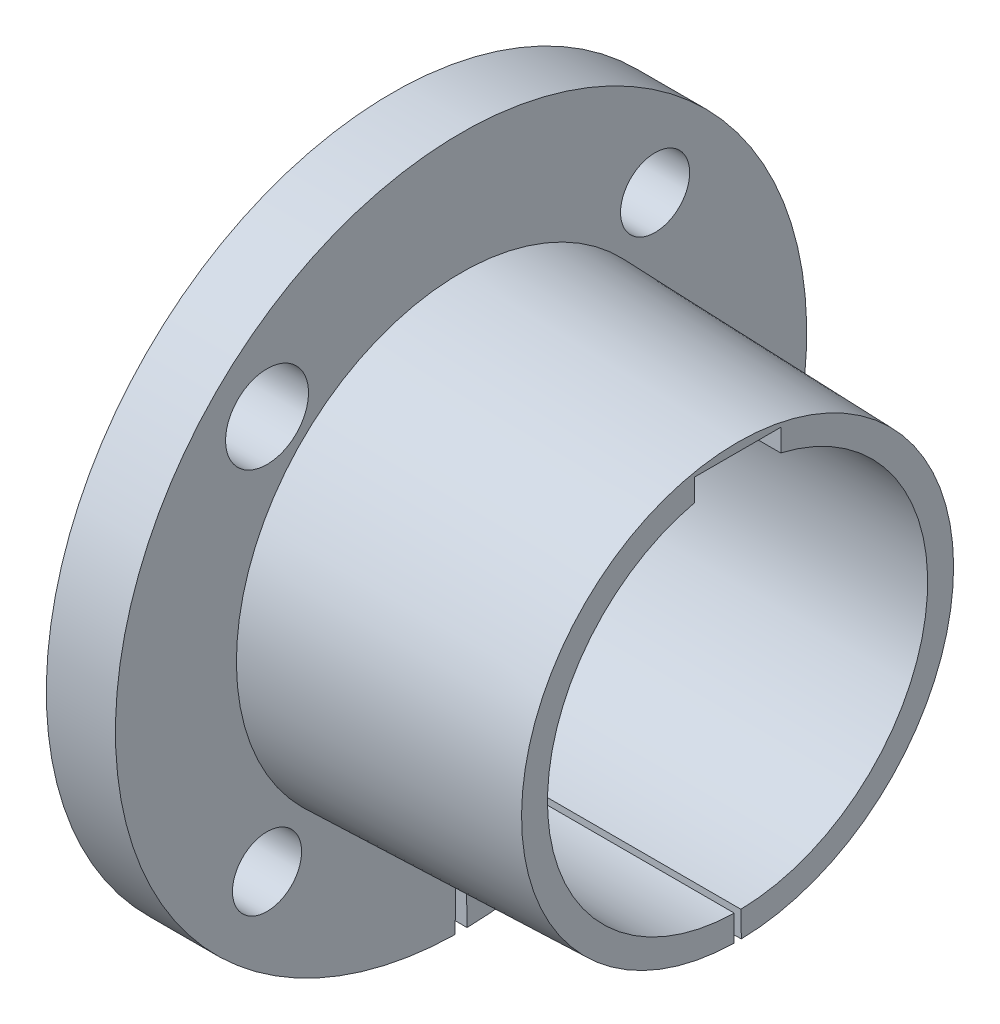
ISO-10303-21;
HEADER;
FILE_DESCRIPTION(('STEP AP214'),'2;1');
FILE_NAME('part.step','',(''),(''),'','','');
FILE_SCHEMA(('AUTOMOTIVE_DESIGN { 1 0 10303 214 1 1 1 1 }'));
ENDSEC;
DATA;
#1=APPLICATION_CONTEXT('core data for automotive mechanical design processes');
#2=APPLICATION_PROTOCOL_DEFINITION('international standard','automotive_design',2000,#1);
#3=PRODUCT_CONTEXT('',#1,'mechanical');
#4=PRODUCT('Part','Part','',(#3));
#5=PRODUCT_RELATED_PRODUCT_CATEGORY('part','',(#4));
#6=PRODUCT_DEFINITION_FORMATION('','',#4);
#7=PRODUCT_DEFINITION_CONTEXT('part definition',#1,'design');
#8=PRODUCT_DEFINITION('design','',#6,#7);
#9=PRODUCT_DEFINITION_SHAPE('','',#8);
#10=(LENGTH_UNIT() NAMED_UNIT(*) SI_UNIT(.MILLI.,.METRE.));
#11=(NAMED_UNIT(*) PLANE_ANGLE_UNIT() SI_UNIT($,.RADIAN.));
#12=(NAMED_UNIT(*) SI_UNIT($,.STERADIAN.) SOLID_ANGLE_UNIT());
#13=UNCERTAINTY_MEASURE_WITH_UNIT(LENGTH_MEASURE(1.E-05),#10,'distance_accuracy_value','');
#14=(GEOMETRIC_REPRESENTATION_CONTEXT(3) GLOBAL_UNCERTAINTY_ASSIGNED_CONTEXT((#13)) GLOBAL_UNIT_ASSIGNED_CONTEXT((#10,
#11,#12)) REPRESENTATION_CONTEXT('',''));
#15=CARTESIAN_POINT('',(0.,0.,0.));
#16=DIRECTION('',(0.,0.,1.));
#17=DIRECTION('',(1.,0.,0.));
#18=AXIS2_PLACEMENT_3D('',#15,#16,#17);
#19=CARTESIAN_POINT('',(-6.35,0.,0.));
#20=DIRECTION('',(1.,0.,0.));
#21=DIRECTION('',(0.,0.,-1.));
#22=AXIS2_PLACEMENT_3D('',#19,#20,#21);
#23=CYLINDRICAL_SURFACE('',#22,17.4624999999998);
#24=DIRECTION('',(-1.,0.,0.));
#25=VECTOR('',#24,1.);
#26=CARTESIAN_POINT('',(25.4,17.0055264454677,-3.96874999999998));
#27=LINE('',#26,#25);
#28=CARTESIAN_POINT('',(25.4,17.0055264454677,-3.96874999999998));
#29=VERTEX_POINT('',#28);
#30=CARTESIAN_POINT('',(-6.35,17.0055264454677,-3.96874999999998));
#31=VERTEX_POINT('',#30);
#32=EDGE_CURVE('E151',#29,#31,#27,.T.);
#33=ORIENTED_EDGE('',*,*,#32,.T.);
#34=CARTESIAN_POINT('',(-6.35,0.,0.));
#35=DIRECTION('',(1.,0.,0.));
#36=DIRECTION('',(0.,0.,-1.));
#37=AXIS2_PLACEMENT_3D('',#34,#35,#36);
#38=CIRCLE('',#37,17.4624999999998);
#39=CARTESIAN_POINT('',(-6.35,-17.4598403766682,-0.304762647411291));
#40=VERTEX_POINT('',#39);
#41=EDGE_CURVE('E43',#40,#31,#38,.T.);
#42=ORIENTED_EDGE('',*,*,#41,.F.);
#43=DIRECTION('',(1.,0.,0.));
#44=VECTOR('',#43,1.);
#45=CARTESIAN_POINT('',(-6.35,-17.4598403766682,-0.304762647411291));
#46=LINE('',#45,#44);
#47=CARTESIAN_POINT('',(25.4,-17.4598403766682,-0.304762647411291));
#48=VERTEX_POINT('',#47);
#49=EDGE_CURVE('E98',#40,#48,#46,.T.);
#50=ORIENTED_EDGE('',*,*,#49,.T.);
#51=CARTESIAN_POINT('',(25.4,0.,0.));
#52=DIRECTION('',(1.,0.,0.));
#53=DIRECTION('',(0.,0.,-1.));
#54=AXIS2_PLACEMENT_3D('',#51,#52,#53);
#55=CIRCLE('',#54,17.4624999999998);
#56=EDGE_CURVE('E95',#48,#29,#55,.T.);
#57=ORIENTED_EDGE('',*,*,#56,.T.);
#58=EDGE_LOOP('',(#33,#42,#50,#57));
#59=FACE_BOUND('',#58,.T.);
#60=ADVANCED_FACE('F33',(#59),#23,.F.);
#61=CARTESIAN_POINT('',(-6.35,0.,0.));
#62=DIRECTION('',(1.,0.,0.));
#63=DIRECTION('',(0.,0.,-1.));
#64=AXIS2_PLACEMENT_3D('',#61,#62,#63);
#65=CYLINDRICAL_SURFACE('',#64,31.7499999999938);
#66=CARTESIAN_POINT('',(0.,0.,0.));
#67=DIRECTION('',(1.,0.,0.));
#68=DIRECTION('',(0.,0.,-1.));
#69=AXIS2_PLACEMENT_3D('',#66,#67,#68);
#70=CIRCLE('',#69,31.75);
#71=CARTESIAN_POINT('',(0.,-31.7451643212154,-0.554113904383627));
#72=VERTEX_POINT('',#71);
#73=CARTESIAN_POINT('',(0.,-31.7451643212092,0.554113904383527));
#74=VERTEX_POINT('',#73);
#75=EDGE_CURVE('E52',#72,#74,#70,.T.);
#76=ORIENTED_EDGE('',*,*,#75,.F.);
#77=DIRECTION('',(-1.,0.,0.));
#78=VECTOR('',#77,1.);
#79=CARTESIAN_POINT('',(25.4,-31.7451643212092,-0.554113904384065));
#80=LINE('',#79,#78);
#81=CARTESIAN_POINT('',(-6.35,-31.7451643212092,-0.554113904384065));
#82=VERTEX_POINT('',#81);
#83=EDGE_CURVE('E173',#72,#82,#80,.T.);
#84=ORIENTED_EDGE('',*,*,#83,.T.);
#85=CARTESIAN_POINT('',(-6.35,0.,0.));
#86=DIRECTION('',(1.,0.,0.));
#87=DIRECTION('',(0.,0.,-1.));
#88=AXIS2_PLACEMENT_3D('',#85,#86,#87);
#89=CIRCLE('',#88,31.7499999999938);
#90=CARTESIAN_POINT('',(-6.35,-31.7451643212092,0.554113904383527));
#91=VERTEX_POINT('',#90);
#92=EDGE_CURVE('E11',#82,#91,#89,.T.);
#93=ORIENTED_EDGE('',*,*,#92,.T.);
#94=DIRECTION('',(-1.,0.,0.));
#95=VECTOR('',#94,1.);
#96=CARTESIAN_POINT('',(25.4,-31.7451643212092,0.554113904383527));
#97=LINE('',#96,#95);
#98=EDGE_CURVE('E154',#74,#91,#97,.T.);
#99=ORIENTED_EDGE('',*,*,#98,.F.);
#100=EDGE_LOOP('',(#76,#84,#93,#99));
#101=FACE_BOUND('',#100,.T.);
#102=ADVANCED_FACE('F218',(#101),#65,.T.);
#103=CARTESIAN_POINT('',(-6.35,-31.7451643212092,-0.554113904384065));
#104=DIRECTION('',(-1.,0.,0.));
#105=DIRECTION('',(0.,0.,1.));
#106=AXIS2_PLACEMENT_3D('',#103,#104,#105);
#107=PLANE('',#106);
#108=CARTESIAN_POINT('',(-6.35,18.0967490910192,-17.8232340594144));
#109=DIRECTION('',(-1.,0.,0.));
#110=DIRECTION('',(0.,0.,1.));
#111=AXIS2_PLACEMENT_3D('',#108,#109,#110);
#112=CIRCLE('',#111,3.17500000000001);
#113=CARTESIAN_POINT('',(-6.35,18.0967490910192,-14.6482340594143));
#114=VERTEX_POINT('',#113);
#115=EDGE_CURVE('E264',#114,#114,#112,.T.);
#116=ORIENTED_EDGE('',*,*,#115,.F.);
#117=EDGE_LOOP('',(#116));
#118=FACE_BOUND('',#117,.T.);
#119=CARTESIAN_POINT('',(-6.35,-18.0967490910192,17.8232340594144));
#120=DIRECTION('',(-1.,0.,0.));
#121=DIRECTION('',(0.,0.,1.));
#122=AXIS2_PLACEMENT_3D('',#119,#120,#121);
#123=CIRCLE('',#122,3.17500000000001);
#124=CARTESIAN_POINT('',(-6.35,-18.0967490910192,20.9982340594144));
#125=VERTEX_POINT('',#124);
#126=EDGE_CURVE('E126',#125,#125,#123,.T.);
#127=ORIENTED_EDGE('',*,*,#126,.F.);
#128=EDGE_LOOP('',(#127));
#129=FACE_BOUND('',#128,.T.);
#130=CARTESIAN_POINT('',(-6.35,-18.0967490910192,-17.8232340594144));
#131=DIRECTION('',(-1.,0.,0.));
#132=DIRECTION('',(0.,0.,1.));
#133=AXIS2_PLACEMENT_3D('',#130,#131,#132);
#134=CIRCLE('',#133,3.80999999999999);
#135=CARTESIAN_POINT('',(-6.35,-18.0967490910192,-14.0132340594144));
#136=VERTEX_POINT('',#135);
#137=EDGE_CURVE('E115',#136,#136,#134,.T.);
#138=ORIENTED_EDGE('',*,*,#137,.F.);
#139=EDGE_LOOP('',(#138));
#140=FACE_BOUND('',#139,.T.);
#141=CARTESIAN_POINT('',(-6.35,18.0967490910192,17.8232340594144));
#142=DIRECTION('',(-1.,0.,0.));
#143=DIRECTION('',(0.,0.,1.));
#144=AXIS2_PLACEMENT_3D('',#141,#142,#143);
#145=CIRCLE('',#144,3.80999999999999);
#146=CARTESIAN_POINT('',(-6.35,18.0967490910192,21.6332340594143));
#147=VERTEX_POINT('',#146);
#148=EDGE_CURVE('E112',#147,#147,#145,.T.);
#149=ORIENTED_EDGE('',*,*,#148,.F.);
#150=EDGE_LOOP('',(#149));
#151=FACE_BOUND('',#150,.T.);
#152=DIRECTION('',(0.,-1.,0.));
#153=VECTOR('',#152,1.);
#154=CARTESIAN_POINT('',(-6.35,19.05,-3.96875));
#155=LINE('',#154,#153);
#156=CARTESIAN_POINT('',(-6.35,19.05,-3.96875));
#157=VERTEX_POINT('',#156);
#158=EDGE_CURVE('E138',#157,#31,#155,.T.);
#159=ORIENTED_EDGE('',*,*,#158,.F.);
#160=DIRECTION('',(0.,0.,-1.));
#161=VECTOR('',#160,1.);
#162=CARTESIAN_POINT('',(-6.35,19.05,3.96875));
#163=LINE('',#162,#161);
#164=CARTESIAN_POINT('',(-6.35,19.05,3.96875));
#165=VERTEX_POINT('',#164);
#166=EDGE_CURVE('E146',#165,#157,#163,.T.);
#167=ORIENTED_EDGE('',*,*,#166,.F.);
#168=DIRECTION('',(0.,1.,0.));
#169=VECTOR('',#168,1.);
#170=CARTESIAN_POINT('',(-6.35,17.0055264454678,3.96875));
#171=LINE('',#170,#169);
#172=CARTESIAN_POINT('',(-6.35,17.0055264454678,3.96875));
#173=VERTEX_POINT('',#172);
#174=EDGE_CURVE('E109',#173,#165,#171,.T.);
#175=ORIENTED_EDGE('',*,*,#174,.F.);
#176=CARTESIAN_POINT('',(-6.35,-17.4598403766682,0.304762647410995));
#177=VERTEX_POINT('',#176);
#178=EDGE_CURVE('E106',#173,#177,#38,.T.);
#179=ORIENTED_EDGE('',*,*,#178,.T.);
#180=DIRECTION('',(0.,0.999847695156391,-0.0174524064372798));
#181=VECTOR('',#180,1.);
#182=CARTESIAN_POINT('',(-6.35,-31.7451643212092,0.554113904383527));
#183=LINE('',#182,#181);
#184=EDGE_CURVE('E165',#91,#177,#183,.T.);
#185=ORIENTED_EDGE('',*,*,#184,.F.);
#186=ORIENTED_EDGE('',*,*,#92,.F.);
#187=DIRECTION('',(0.,0.999847695156391,0.0174524064372968));
#188=VECTOR('',#187,1.);
#189=CARTESIAN_POINT('',(-6.35,-31.7451643212092,-0.554113904384065));
#190=LINE('',#189,#188);
#191=EDGE_CURVE('E102',#82,#40,#190,.T.);
#192=ORIENTED_EDGE('',*,*,#191,.T.);
#193=ORIENTED_EDGE('',*,*,#41,.T.);
#194=EDGE_LOOP('',(#159,#167,#175,#179,#185,#186,#192,#193));
#195=FACE_BOUND('',#194,.T.);
#196=ADVANCED_FACE('F181',(#118,#129,#140,#151,#195),#107,.T.);
#197=DIRECTION('',(-1.,0.,0.));
#198=VECTOR('',#197,1.);
#199=CARTESIAN_POINT('',(25.4,17.0055264454678,3.96875));
#200=LINE('',#199,#198);
#201=CARTESIAN_POINT('',(25.4,17.0055264454678,3.96875));
#202=VERTEX_POINT('',#201);
#203=EDGE_CURVE('E143',#202,#173,#200,.T.);
#204=ORIENTED_EDGE('',*,*,#203,.F.);
#205=CARTESIAN_POINT('',(25.4,-17.4598403766682,0.304762647410995));
#206=VERTEX_POINT('',#205);
#207=EDGE_CURVE('E97',#202,#206,#55,.T.);
#208=ORIENTED_EDGE('',*,*,#207,.T.);
#209=DIRECTION('',(1.,0.,0.));
#210=VECTOR('',#209,1.);
#211=CARTESIAN_POINT('',(-6.35,-17.4598403766682,0.304762647410995));
#212=LINE('',#211,#210);
#213=EDGE_CURVE('E168',#177,#206,#212,.T.);
#214=ORIENTED_EDGE('',*,*,#213,.F.);
#215=ORIENTED_EDGE('',*,*,#178,.F.);
#216=EDGE_LOOP('',(#204,#208,#214,#215));
#217=FACE_BOUND('',#216,.T.);
#218=ADVANCED_FACE('F225',(#217),#23,.F.);
#219=CARTESIAN_POINT('',(25.4,-17.4598403766682,-0.304762647411291));
#220=DIRECTION('',(1.,0.,0.));
#221=DIRECTION('',(0.,0.,-1.));
#222=AXIS2_PLACEMENT_3D('',#219,#220,#221);
#223=PLANE('',#222);
#224=CARTESIAN_POINT('',(25.4,0.,0.));
#225=DIRECTION('',(1.,0.,0.));
#226=DIRECTION('',(0.,0.,-1.));
#227=AXIS2_PLACEMENT_3D('',#224,#225,#226);
#228=CIRCLE('',#227,19.8437103327143);
#229=CARTESIAN_POINT('',(25.4,-19.8406880395155,0.34632049795018));
#230=VERTEX_POINT('',#229);
#231=CARTESIAN_POINT('',(25.4,-19.8406880395155,-0.346320497950517));
#232=VERTEX_POINT('',#231);
#233=EDGE_CURVE('E70',#230,#232,#228,.F.);
#234=ORIENTED_EDGE('',*,*,#233,.F.);
#235=DIRECTION('',(0.,-0.999847695156391,0.0174524064372798));
#236=VECTOR('',#235,1.);
#237=CARTESIAN_POINT('',(25.4,-17.4598403766682,0.304762647410995));
#238=LINE('',#237,#236);
#239=EDGE_CURVE('E171',#206,#230,#238,.T.);
#240=ORIENTED_EDGE('',*,*,#239,.F.);
#241=ORIENTED_EDGE('',*,*,#207,.F.);
#242=DIRECTION('',(0.,1.,0.));
#243=VECTOR('',#242,1.);
#244=CARTESIAN_POINT('',(25.4,17.0055264454678,3.96875));
#245=LINE('',#244,#243);
#246=CARTESIAN_POINT('',(25.4,19.05,3.96875));
#247=VERTEX_POINT('',#246);
#248=EDGE_CURVE('E134',#202,#247,#245,.T.);
#249=ORIENTED_EDGE('',*,*,#248,.T.);
#250=DIRECTION('',(0.,0.,-1.));
#251=VECTOR('',#250,1.);
#252=CARTESIAN_POINT('',(25.4,19.05,3.96875));
#253=LINE('',#252,#251);
#254=CARTESIAN_POINT('',(25.4,19.05,-3.96875));
#255=VERTEX_POINT('',#254);
#256=EDGE_CURVE('E137',#247,#255,#253,.T.);
#257=ORIENTED_EDGE('',*,*,#256,.T.);
#258=DIRECTION('',(0.,-1.,0.));
#259=VECTOR('',#258,1.);
#260=CARTESIAN_POINT('',(25.4,19.05,-3.96875));
#261=LINE('',#260,#259);
#262=EDGE_CURVE('E141',#255,#29,#261,.T.);
#263=ORIENTED_EDGE('',*,*,#262,.T.);
#264=ORIENTED_EDGE('',*,*,#56,.F.);
#265=DIRECTION('',(0.,-0.999847695156391,-0.0174524064372968));
#266=VECTOR('',#265,1.);
#267=CARTESIAN_POINT('',(25.4,-17.4598403766682,-0.304762647411291));
#268=LINE('',#267,#266);
#269=EDGE_CURVE('E86',#48,#232,#268,.T.);
#270=ORIENTED_EDGE('',*,*,#269,.T.);
#271=EDGE_LOOP('',(#234,#240,#241,#249,#257,#263,#264,#270));
#272=FACE_BOUND('',#271,.T.);
#273=ADVANCED_FACE('F92',(#272),#223,.T.);
#274=CARTESIAN_POINT('',(0.,0.,0.));
#275=DIRECTION('',(0.,0.0174524064372968,-0.999847695156391));
#276=DIRECTION('',(0.,0.999847695156391,0.0174524064372968));
#277=AXIS2_PLACEMENT_3D('',#274,#275,#276);
#278=PLANE('',#277);
#279=DIRECTION('',(0.,-0.999847695156391,-0.0174524064372799));
#280=VECTOR('',#279,1.);
#281=CARTESIAN_POINT('',(0.,-20.6343568087889,-0.360174037849344));
#282=LINE('',#281,#280);
#283=CARTESIAN_POINT('',(0.,-20.6343568087889,-0.360174037849344));
#284=VERTEX_POINT('',#283);
#285=EDGE_CURVE('E88',#284,#72,#282,.T.);
#286=ORIENTED_EDGE('',*,*,#285,.F.);
#287=DIRECTION('',(-0.999512027354013,-0.0312315543552781,-0.000545148809080951));
#288=VECTOR('',#287,1.);
#289=CARTESIAN_POINT('',(660.366998468433,0.,0.));
#290=LINE('',#289,#288);
#291=EDGE_CURVE('E72',#284,#232,#290,.F.);
#292=ORIENTED_EDGE('',*,*,#291,.T.);
#293=ORIENTED_EDGE('',*,*,#269,.F.);
#294=ORIENTED_EDGE('',*,*,#49,.F.);
#295=ORIENTED_EDGE('',*,*,#191,.F.);
#296=ORIENTED_EDGE('',*,*,#83,.F.);
#297=EDGE_LOOP('',(#286,#292,#293,#294,#295,#296));
#298=FACE_BOUND('',#297,.T.);
#299=ADVANCED_FACE('F84',(#298),#278,.F.);
#300=CARTESIAN_POINT('',(0.,0.,0.));
#301=DIRECTION('',(0.,-0.0174524064372798,-0.999847695156391));
#302=DIRECTION('',(0.,0.999847695156391,-0.0174524064372798));
#303=AXIS2_PLACEMENT_3D('',#300,#301,#302);
#304=PLANE('',#303);
#305=DIRECTION('',(-0.999512027354013,-0.0312315543552781,0.000545148809080422));
#306=VECTOR('',#305,1.);
#307=CARTESIAN_POINT('',(660.366998468433,0.,0.));
#308=LINE('',#307,#306);
#309=CARTESIAN_POINT('',(0.,-20.6343568087889,0.360174037849325));
#310=VERTEX_POINT('',#309);
#311=EDGE_CURVE('E65',#310,#230,#308,.F.);
#312=ORIENTED_EDGE('',*,*,#311,.F.);
#313=DIRECTION('',(0.,0.999847695156391,-0.0174524064373015));
#314=VECTOR('',#313,1.);
#315=CARTESIAN_POINT('',(0.,-31.7451643212154,0.554113904383857));
#316=LINE('',#315,#314);
#317=EDGE_CURVE('E89',#74,#310,#316,.T.);
#318=ORIENTED_EDGE('',*,*,#317,.F.);
#319=ORIENTED_EDGE('',*,*,#98,.T.);
#320=ORIENTED_EDGE('',*,*,#184,.T.);
#321=ORIENTED_EDGE('',*,*,#213,.T.);
#322=ORIENTED_EDGE('',*,*,#239,.T.);
#323=EDGE_LOOP('',(#312,#318,#319,#320,#321,#322));
#324=FACE_BOUND('',#323,.T.);
#325=ADVANCED_FACE('F220',(#324),#304,.T.);
#326=CARTESIAN_POINT('',(25.4,19.05,-3.96875));
#327=DIRECTION('',(0.,0.,-1.));
#328=DIRECTION('',(0.,1.,0.));
#329=AXIS2_PLACEMENT_3D('',#326,#327,#328);
#330=PLANE('',#329);
#331=ORIENTED_EDGE('',*,*,#158,.T.);
#332=ORIENTED_EDGE('',*,*,#32,.F.);
#333=ORIENTED_EDGE('',*,*,#262,.F.);
#334=DIRECTION('',(-1.,0.,0.));
#335=VECTOR('',#334,1.);
#336=CARTESIAN_POINT('',(25.4,19.05,-3.96875));
#337=LINE('',#336,#335);
#338=EDGE_CURVE('E155',#255,#157,#337,.T.);
#339=ORIENTED_EDGE('',*,*,#338,.T.);
#340=EDGE_LOOP('',(#331,#332,#333,#339));
#341=FACE_BOUND('',#340,.T.);
#342=ADVANCED_FACE('F236',(#341),#330,.F.);
#343=CARTESIAN_POINT('',(25.4,19.05,3.96875));
#344=DIRECTION('',(0.,1.,0.));
#345=DIRECTION('',(0.,0.,1.));
#346=AXIS2_PLACEMENT_3D('',#343,#344,#345);
#347=PLANE('',#346);
#348=ORIENTED_EDGE('',*,*,#166,.T.);
#349=ORIENTED_EDGE('',*,*,#338,.F.);
#350=ORIENTED_EDGE('',*,*,#256,.F.);
#351=DIRECTION('',(-1.,0.,0.));
#352=VECTOR('',#351,1.);
#353=CARTESIAN_POINT('',(25.4,19.05,3.96875));
#354=LINE('',#353,#352);
#355=EDGE_CURVE('E158',#247,#165,#354,.T.);
#356=ORIENTED_EDGE('',*,*,#355,.T.);
#357=EDGE_LOOP('',(#348,#349,#350,#356));
#358=FACE_BOUND('',#357,.T.);
#359=ADVANCED_FACE('F233',(#358),#347,.F.);
#360=CARTESIAN_POINT('',(25.4,17.0055264454678,3.96875));
#361=DIRECTION('',(0.,0.,1.));
#362=DIRECTION('',(1.,0.,0.));
#363=AXIS2_PLACEMENT_3D('',#360,#361,#362);
#364=PLANE('',#363);
#365=ORIENTED_EDGE('',*,*,#174,.T.);
#366=ORIENTED_EDGE('',*,*,#355,.F.);
#367=ORIENTED_EDGE('',*,*,#248,.F.);
#368=ORIENTED_EDGE('',*,*,#203,.T.);
#369=EDGE_LOOP('',(#365,#366,#367,#368));
#370=FACE_BOUND('',#369,.T.);
#371=ADVANCED_FACE('F229',(#370),#364,.F.);
#372=CARTESIAN_POINT('',(0.,0.,0.));
#373=DIRECTION('',(-1.,0.,0.));
#374=DIRECTION('',(0.,0.,1.));
#375=AXIS2_PLACEMENT_3D('',#372,#373,#374);
#376=CONICAL_SURFACE('',#375,20.6374999999989,0.0312413936106957);
#377=ORIENTED_EDGE('',*,*,#233,.T.);
#378=ORIENTED_EDGE('',*,*,#291,.F.);
#379=CARTESIAN_POINT('',(0.,0.,0.));
#380=DIRECTION('',(-1.,0.,0.));
#381=DIRECTION('',(0.,0.,1.));
#382=AXIS2_PLACEMENT_3D('',#379,#380,#381);
#383=CIRCLE('',#382,20.6374999999989);
#384=EDGE_CURVE('E78',#310,#284,#383,.T.);
#385=ORIENTED_EDGE('',*,*,#384,.F.);
#386=ORIENTED_EDGE('',*,*,#311,.T.);
#387=EDGE_LOOP('',(#377,#378,#385,#386));
#388=FACE_BOUND('',#387,.T.);
#389=ADVANCED_FACE('F35',(#388),#376,.T.);
#390=CARTESIAN_POINT('',(0.,0.,0.));
#391=DIRECTION('',(-1.,0.,0.));
#392=DIRECTION('',(0.,0.,1.));
#393=AXIS2_PLACEMENT_3D('',#390,#391,#392);
#394=PLANE('',#393);
#395=CARTESIAN_POINT('',(0.,18.0967490910192,-17.8232340594144));
#396=DIRECTION('',(-1.,0.,0.));
#397=DIRECTION('',(0.,0.,1.));
#398=AXIS2_PLACEMENT_3D('',#395,#396,#397);
#399=CIRCLE('',#398,3.17500000000001);
#400=CARTESIAN_POINT('',(0.,18.0967490910192,-14.6482340594143));
#401=VERTEX_POINT('',#400);
#402=EDGE_CURVE('E37',#401,#401,#399,.T.);
#403=ORIENTED_EDGE('',*,*,#402,.T.);
#404=EDGE_LOOP('',(#403));
#405=FACE_BOUND('',#404,.T.);
#406=CARTESIAN_POINT('',(0.,-18.0967490910192,17.8232340594144));
#407=DIRECTION('',(-1.,0.,0.));
#408=DIRECTION('',(0.,0.,1.));
#409=AXIS2_PLACEMENT_3D('',#406,#407,#408);
#410=CIRCLE('',#409,3.17500000000001);
#411=CARTESIAN_POINT('',(0.,-18.0967490910192,20.9982340594144));
#412=VERTEX_POINT('',#411);
#413=EDGE_CURVE('E121',#412,#412,#410,.T.);
#414=ORIENTED_EDGE('',*,*,#413,.T.);
#415=EDGE_LOOP('',(#414));
#416=FACE_BOUND('',#415,.T.);
#417=CARTESIAN_POINT('',(0.,-18.0967490910192,-17.8232340594144));
#418=DIRECTION('',(-1.,0.,0.));
#419=DIRECTION('',(0.,0.,1.));
#420=AXIS2_PLACEMENT_3D('',#417,#418,#419);
#421=CIRCLE('',#420,3.80999999999999);
#422=CARTESIAN_POINT('',(0.,-18.0967490910192,-14.0132340594144));
#423=VERTEX_POINT('',#422);
#424=EDGE_CURVE('E113',#423,#423,#421,.T.);
#425=ORIENTED_EDGE('',*,*,#424,.T.);
#426=EDGE_LOOP('',(#425));
#427=FACE_BOUND('',#426,.T.);
#428=CARTESIAN_POINT('',(0.,18.0967490910192,17.8232340594144));
#429=DIRECTION('',(-1.,0.,0.));
#430=DIRECTION('',(0.,0.,1.));
#431=AXIS2_PLACEMENT_3D('',#428,#429,#430);
#432=CIRCLE('',#431,3.80999999999999);
#433=CARTESIAN_POINT('',(0.,18.0967490910192,21.6332340594143));
#434=VERTEX_POINT('',#433);
#435=EDGE_CURVE('E79',#434,#434,#432,.T.);
#436=ORIENTED_EDGE('',*,*,#435,.T.);
#437=EDGE_LOOP('',(#436));
#438=FACE_BOUND('',#437,.T.);
#439=ORIENTED_EDGE('',*,*,#384,.T.);
#440=ORIENTED_EDGE('',*,*,#285,.T.);
#441=ORIENTED_EDGE('',*,*,#75,.T.);
#442=ORIENTED_EDGE('',*,*,#317,.T.);
#443=EDGE_LOOP('',(#439,#440,#441,#442));
#444=FACE_BOUND('',#443,.T.);
#445=ADVANCED_FACE('F215',(#405,#416,#427,#438,#444),#394,.F.);
#446=CARTESIAN_POINT('',(-6.35,18.0967490910192,17.8232340594144));
#447=DIRECTION('',(-1.,0.,0.));
#448=DIRECTION('',(0.,0.,1.));
#449=AXIS2_PLACEMENT_3D('',#446,#447,#448);
#450=CYLINDRICAL_SURFACE('',#449,3.80999999999999);
#451=ORIENTED_EDGE('',*,*,#148,.T.);
#452=EDGE_LOOP('',(#451));
#453=FACE_BOUND('',#452,.T.);
#454=ORIENTED_EDGE('',*,*,#435,.F.);
#455=EDGE_LOOP('',(#454));
#456=FACE_BOUND('',#455,.T.);
#457=ADVANCED_FACE('F271',(#453,#456),#450,.F.);
#458=CARTESIAN_POINT('',(-6.35,-18.0967490910192,-17.8232340594144));
#459=DIRECTION('',(-1.,0.,0.));
#460=DIRECTION('',(0.,0.,1.));
#461=AXIS2_PLACEMENT_3D('',#458,#459,#460);
#462=CYLINDRICAL_SURFACE('',#461,3.80999999999999);
#463=ORIENTED_EDGE('',*,*,#137,.T.);
#464=EDGE_LOOP('',(#463));
#465=FACE_BOUND('',#464,.T.);
#466=ORIENTED_EDGE('',*,*,#424,.F.);
#467=EDGE_LOOP('',(#466));
#468=FACE_BOUND('',#467,.T.);
#469=ADVANCED_FACE('F274',(#465,#468),#462,.F.);
#470=CARTESIAN_POINT('',(-6.35,-18.0967490910192,17.8232340594144));
#471=DIRECTION('',(-1.,0.,0.));
#472=DIRECTION('',(0.,0.,1.));
#473=AXIS2_PLACEMENT_3D('',#470,#471,#472);
#474=CYLINDRICAL_SURFACE('',#473,3.17500000000001);
#475=ORIENTED_EDGE('',*,*,#126,.T.);
#476=EDGE_LOOP('',(#475));
#477=FACE_BOUND('',#476,.T.);
#478=ORIENTED_EDGE('',*,*,#413,.F.);
#479=EDGE_LOOP('',(#478));
#480=FACE_BOUND('',#479,.T.);
#481=ADVANCED_FACE('F288',(#477,#480),#474,.F.);
#482=CARTESIAN_POINT('',(-6.35,18.0967490910192,-17.8232340594144));
#483=DIRECTION('',(-1.,0.,0.));
#484=DIRECTION('',(0.,0.,1.));
#485=AXIS2_PLACEMENT_3D('',#482,#483,#484);
#486=CYLINDRICAL_SURFACE('',#485,3.17500000000001);
#487=ORIENTED_EDGE('',*,*,#115,.T.);
#488=EDGE_LOOP('',(#487));
#489=FACE_BOUND('',#488,.T.);
#490=ORIENTED_EDGE('',*,*,#402,.F.);
#491=EDGE_LOOP('',(#490));
#492=FACE_BOUND('',#491,.T.);
#493=ADVANCED_FACE('F291',(#489,#492),#486,.F.);
#494=CLOSED_SHELL('',(#60,#102,#196,#218,#273,#299,#325,#342,#359,#371,#389,#445,#457,#469,#481,#493));
#495=MANIFOLD_SOLID_BREP('B2',#494);
#496=ADVANCED_BREP_SHAPE_REPRESENTATION('',(#18,#495),#14);
#497=SHAPE_DEFINITION_REPRESENTATION(#9,#496);
ENDSEC;
END-ISO-10303-21;
